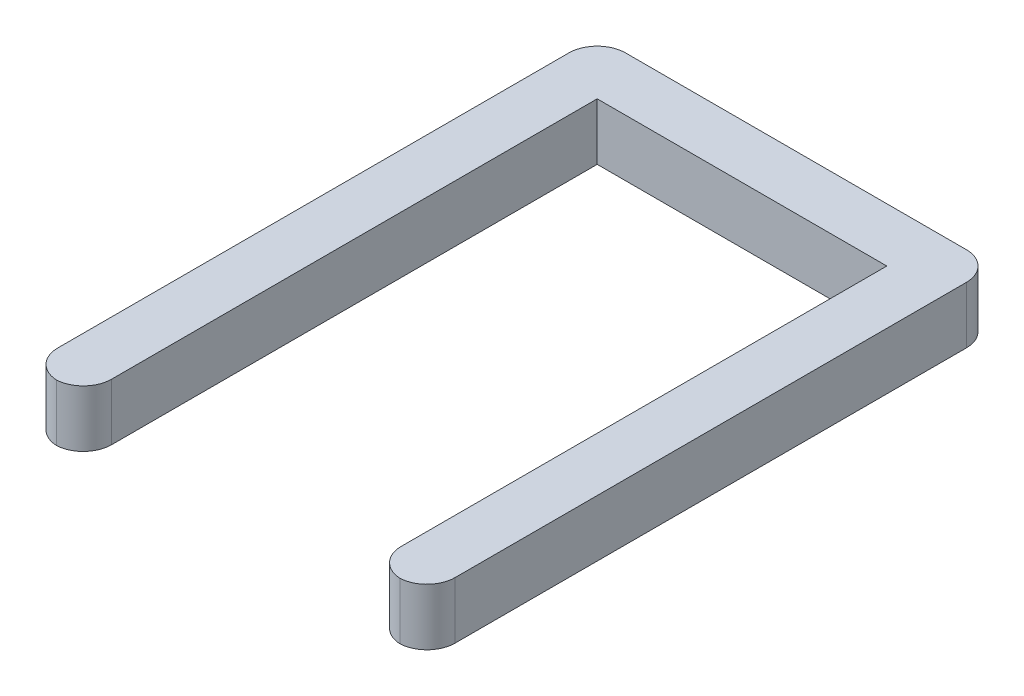
ISO-10303-21;
HEADER;
FILE_DESCRIPTION(('STEP AP214'),'2;1');
FILE_NAME('part.step','',(''),(''),'','','');
FILE_SCHEMA(('AUTOMOTIVE_DESIGN { 1 0 10303 214 1 1 1 1 }'));
ENDSEC;
DATA;
#1=APPLICATION_CONTEXT('core data for automotive mechanical design processes');
#2=APPLICATION_PROTOCOL_DEFINITION('international standard','automotive_design',2000,#1);
#3=PRODUCT_CONTEXT('',#1,'mechanical');
#4=PRODUCT('Part','Part','',(#3));
#5=PRODUCT_RELATED_PRODUCT_CATEGORY('part','',(#4));
#6=PRODUCT_DEFINITION_FORMATION('','',#4);
#7=PRODUCT_DEFINITION_CONTEXT('part definition',#1,'design');
#8=PRODUCT_DEFINITION('design','',#6,#7);
#9=PRODUCT_DEFINITION_SHAPE('','',#8);
#10=(LENGTH_UNIT() NAMED_UNIT(*) SI_UNIT(.MILLI.,.METRE.));
#11=(NAMED_UNIT(*) PLANE_ANGLE_UNIT() SI_UNIT($,.RADIAN.));
#12=(NAMED_UNIT(*) SI_UNIT($,.STERADIAN.) SOLID_ANGLE_UNIT());
#13=UNCERTAINTY_MEASURE_WITH_UNIT(LENGTH_MEASURE(1.E-05),#10,'distance_accuracy_value','');
#14=(GEOMETRIC_REPRESENTATION_CONTEXT(3) GLOBAL_UNCERTAINTY_ASSIGNED_CONTEXT((#13)) GLOBAL_UNIT_ASSIGNED_CONTEXT((#10,
#11,#12)) REPRESENTATION_CONTEXT('',''));
#15=CARTESIAN_POINT('',(0.,0.,0.));
#16=DIRECTION('',(0.,0.,1.));
#17=DIRECTION('',(1.,0.,0.));
#18=AXIS2_PLACEMENT_3D('',#15,#16,#17);
#19=CARTESIAN_POINT('',(0.,10.,0.));
#20=DIRECTION('',(1.,0.,0.));
#21=DIRECTION('',(0.,0.,-1.));
#22=AXIS2_PLACEMENT_3D('',#19,#20,#21);
#23=PLANE('',#22);
#24=DIRECTION('',(0.,0.,1.));
#25=VECTOR('',#24,1.);
#26=CARTESIAN_POINT('',(0.,10.,0.));
#27=LINE('',#26,#25);
#28=CARTESIAN_POINT('',(0.,10.,5.));
#29=VERTEX_POINT('',#28);
#30=CARTESIAN_POINT('',(0.,10.,95.));
#31=VERTEX_POINT('',#30);
#32=EDGE_CURVE('E158',#29,#31,#27,.T.);
#33=ORIENTED_EDGE('',*,*,#32,.F.);
#34=DIRECTION('',(0.,-1.,0.));
#35=VECTOR('',#34,1.);
#36=CARTESIAN_POINT('',(0.,10.,5.));
#37=LINE('',#36,#35);
#38=CARTESIAN_POINT('',(0.,0.,5.));
#39=VERTEX_POINT('',#38);
#40=EDGE_CURVE('E203',#29,#39,#37,.T.);
#41=ORIENTED_EDGE('',*,*,#40,.T.);
#42=DIRECTION('',(0.,0.,1.));
#43=VECTOR('',#42,1.);
#44=CARTESIAN_POINT('',(0.,0.,0.));
#45=LINE('',#44,#43);
#46=CARTESIAN_POINT('',(0.,0.,95.));
#47=VERTEX_POINT('',#46);
#48=EDGE_CURVE('E135',#39,#47,#45,.T.);
#49=ORIENTED_EDGE('',*,*,#48,.T.);
#50=DIRECTION('',(0.,-1.,0.));
#51=VECTOR('',#50,1.);
#52=CARTESIAN_POINT('',(0.,10.,95.));
#53=LINE('',#52,#51);
#54=EDGE_CURVE('E201',#47,#31,#53,.F.);
#55=ORIENTED_EDGE('',*,*,#54,.T.);
#56=EDGE_LOOP('',(#33,#41,#49,#55));
#57=FACE_BOUND('',#56,.T.);
#58=ADVANCED_FACE('F33',(#57),#23,.F.);
#59=CARTESIAN_POINT('',(70.,10.,0.));
#60=DIRECTION('',(-1.,0.,0.));
#61=DIRECTION('',(0.,0.,1.));
#62=AXIS2_PLACEMENT_3D('',#59,#60,#61);
#63=PLANE('',#62);
#64=DIRECTION('',(0.,0.,-1.));
#65=VECTOR('',#64,1.);
#66=CARTESIAN_POINT('',(70.,10.,0.));
#67=LINE('',#66,#65);
#68=CARTESIAN_POINT('',(70.,10.,95.));
#69=VERTEX_POINT('',#68);
#70=CARTESIAN_POINT('',(70.,10.,5.));
#71=VERTEX_POINT('',#70);
#72=EDGE_CURVE('E161',#69,#71,#67,.T.);
#73=ORIENTED_EDGE('',*,*,#72,.F.);
#74=DIRECTION('',(0.,-1.,0.));
#75=VECTOR('',#74,1.);
#76=CARTESIAN_POINT('',(70.,10.,95.));
#77=LINE('',#76,#75);
#78=CARTESIAN_POINT('',(70.,0.,95.));
#79=VERTEX_POINT('',#78);
#80=EDGE_CURVE('E11',#69,#79,#77,.T.);
#81=ORIENTED_EDGE('',*,*,#80,.T.);
#82=DIRECTION('',(0.,0.,-1.));
#83=VECTOR('',#82,1.);
#84=CARTESIAN_POINT('',(70.,0.,0.));
#85=LINE('',#84,#83);
#86=CARTESIAN_POINT('',(70.,0.,5.));
#87=VERTEX_POINT('',#86);
#88=EDGE_CURVE('E171',#79,#87,#85,.T.);
#89=ORIENTED_EDGE('',*,*,#88,.T.);
#90=DIRECTION('',(0.,-1.,0.));
#91=VECTOR('',#90,1.);
#92=CARTESIAN_POINT('',(70.,10.,5.));
#93=LINE('',#92,#91);
#94=EDGE_CURVE('E42',#87,#71,#93,.F.);
#95=ORIENTED_EDGE('',*,*,#94,.T.);
#96=EDGE_LOOP('',(#73,#81,#89,#95));
#97=FACE_BOUND('',#96,.T.);
#98=ADVANCED_FACE('F230',(#97),#63,.F.);
#99=CARTESIAN_POINT('',(0.,10.,0.));
#100=DIRECTION('',(0.,0.,1.));
#101=DIRECTION('',(1.,0.,0.));
#102=AXIS2_PLACEMENT_3D('',#99,#100,#101);
#103=PLANE('',#102);
#104=DIRECTION('',(-1.,0.,0.));
#105=VECTOR('',#104,1.);
#106=CARTESIAN_POINT('',(0.,0.,0.));
#107=LINE('',#106,#105);
#108=CARTESIAN_POINT('',(65.,0.,0.));
#109=VERTEX_POINT('',#108);
#110=CARTESIAN_POINT('',(5.,0.,0.));
#111=VERTEX_POINT('',#110);
#112=EDGE_CURVE('E162',#109,#111,#107,.T.);
#113=ORIENTED_EDGE('',*,*,#112,.T.);
#114=DIRECTION('',(0.,-1.,0.));
#115=VECTOR('',#114,1.);
#116=CARTESIAN_POINT('',(5.,10.,0.));
#117=LINE('',#116,#115);
#118=CARTESIAN_POINT('',(5.,10.,0.));
#119=VERTEX_POINT('',#118);
#120=EDGE_CURVE('E209',#111,#119,#117,.F.);
#121=ORIENTED_EDGE('',*,*,#120,.T.);
#122=DIRECTION('',(-1.,0.,0.));
#123=VECTOR('',#122,1.);
#124=CARTESIAN_POINT('',(0.,10.,0.));
#125=LINE('',#124,#123);
#126=CARTESIAN_POINT('',(65.,10.,0.));
#127=VERTEX_POINT('',#126);
#128=EDGE_CURVE('E165',#127,#119,#125,.T.);
#129=ORIENTED_EDGE('',*,*,#128,.F.);
#130=DIRECTION('',(0.,-1.,0.));
#131=VECTOR('',#130,1.);
#132=CARTESIAN_POINT('',(65.,10.,0.));
#133=LINE('',#132,#131);
#134=EDGE_CURVE('E206',#127,#109,#133,.T.);
#135=ORIENTED_EDGE('',*,*,#134,.T.);
#136=EDGE_LOOP('',(#113,#121,#129,#135));
#137=FACE_BOUND('',#136,.T.);
#138=ADVANCED_FACE('F237',(#137),#103,.F.);
#139=CARTESIAN_POINT('',(0.,10.,0.));
#140=DIRECTION('',(0.,1.,0.));
#141=DIRECTION('',(0.,0.,1.));
#142=AXIS2_PLACEMENT_3D('',#139,#140,#141);
#143=PLANE('',#142);
#144=ORIENTED_EDGE('',*,*,#128,.T.);
#145=CARTESIAN_POINT('',(5.,10.,5.));
#146=DIRECTION('',(0.,1.,0.));
#147=DIRECTION('',(0.,0.,1.));
#148=AXIS2_PLACEMENT_3D('',#145,#146,#147);
#149=CIRCLE('',#148,5.);
#150=EDGE_CURVE('E185',#119,#29,#149,.T.);
#151=ORIENTED_EDGE('',*,*,#150,.T.);
#152=ORIENTED_EDGE('',*,*,#32,.T.);
#153=CARTESIAN_POINT('',(5.00000000000001,10.,95.));
#154=DIRECTION('',(0.,1.,0.));
#155=DIRECTION('',(0.,0.,1.));
#156=AXIS2_PLACEMENT_3D('',#153,#154,#155);
#157=CIRCLE('',#156,5.);
#158=CARTESIAN_POINT('',(4.75000000000001,10.,99.9937460888596));
#159=VERTEX_POINT('',#158);
#160=EDGE_CURVE('E181',#31,#159,#157,.T.);
#161=ORIENTED_EDGE('',*,*,#160,.T.);
#162=CARTESIAN_POINT('',(4.50000000000001,10.,95.));
#163=DIRECTION('',(0.,1.,0.));
#164=DIRECTION('',(0.,0.,1.));
#165=AXIS2_PLACEMENT_3D('',#162,#163,#164);
#166=CIRCLE('',#165,5.);
#167=CARTESIAN_POINT('',(9.50000000000001,10.,95.));
#168=VERTEX_POINT('',#167);
#169=EDGE_CURVE('E183',#159,#168,#166,.T.);
#170=ORIENTED_EDGE('',*,*,#169,.T.);
#171=DIRECTION('',(0.,0.,1.));
#172=VECTOR('',#171,1.);
#173=CARTESIAN_POINT('',(9.5,10.,9.5));
#174=LINE('',#173,#172);
#175=CARTESIAN_POINT('',(9.5,10.,9.5));
#176=VERTEX_POINT('',#175);
#177=EDGE_CURVE('E152',#176,#168,#174,.T.);
#178=ORIENTED_EDGE('',*,*,#177,.F.);
#179=DIRECTION('',(-1.,0.,0.));
#180=VECTOR('',#179,1.);
#181=CARTESIAN_POINT('',(9.5,10.,9.5));
#182=LINE('',#181,#180);
#183=CARTESIAN_POINT('',(60.5,10.,9.5));
#184=VERTEX_POINT('',#183);
#185=EDGE_CURVE('E131',#184,#176,#182,.T.);
#186=ORIENTED_EDGE('',*,*,#185,.F.);
#187=DIRECTION('',(0.,0.,-1.));
#188=VECTOR('',#187,1.);
#189=CARTESIAN_POINT('',(60.5,10.,9.5));
#190=LINE('',#189,#188);
#191=CARTESIAN_POINT('',(60.5,10.,95.));
#192=VERTEX_POINT('',#191);
#193=EDGE_CURVE('E154',#192,#184,#190,.T.);
#194=ORIENTED_EDGE('',*,*,#193,.F.);
#195=CARTESIAN_POINT('',(65.5,10.,95.));
#196=DIRECTION('',(0.,1.,0.));
#197=DIRECTION('',(0.,0.,1.));
#198=AXIS2_PLACEMENT_3D('',#195,#196,#197);
#199=CIRCLE('',#198,5.);
#200=CARTESIAN_POINT('',(65.25,10.,99.9937460888596));
#201=VERTEX_POINT('',#200);
#202=EDGE_CURVE('E179',#192,#201,#199,.T.);
#203=ORIENTED_EDGE('',*,*,#202,.T.);
#204=CARTESIAN_POINT('',(65.,10.,95.));
#205=DIRECTION('',(0.,1.,0.));
#206=DIRECTION('',(0.,0.,1.));
#207=AXIS2_PLACEMENT_3D('',#204,#205,#206);
#208=CIRCLE('',#207,5.);
#209=EDGE_CURVE('E177',#201,#69,#208,.T.);
#210=ORIENTED_EDGE('',*,*,#209,.T.);
#211=ORIENTED_EDGE('',*,*,#72,.T.);
#212=CARTESIAN_POINT('',(65.,10.,5.));
#213=DIRECTION('',(0.,1.,0.));
#214=DIRECTION('',(0.,0.,1.));
#215=AXIS2_PLACEMENT_3D('',#212,#213,#214);
#216=CIRCLE('',#215,5.);
#217=EDGE_CURVE('E168',#71,#127,#216,.T.);
#218=ORIENTED_EDGE('',*,*,#217,.T.);
#219=EDGE_LOOP('',(#144,#151,#152,#161,#170,#178,#186,#194,#203,#210,#211,#218));
#220=FACE_BOUND('',#219,.T.);
#221=ADVANCED_FACE('F226',(#220),#143,.T.);
#222=CARTESIAN_POINT('',(0.,0.,0.));
#223=DIRECTION('',(0.,1.,0.));
#224=DIRECTION('',(0.,0.,1.));
#225=AXIS2_PLACEMENT_3D('',#222,#223,#224);
#226=PLANE('',#225);
#227=ORIENTED_EDGE('',*,*,#48,.F.);
#228=CARTESIAN_POINT('',(5.,0.,5.));
#229=DIRECTION('',(0.,1.,0.));
#230=DIRECTION('',(0.,0.,1.));
#231=AXIS2_PLACEMENT_3D('',#228,#229,#230);
#232=CIRCLE('',#231,5.);
#233=EDGE_CURVE('E196',#39,#111,#232,.F.);
#234=ORIENTED_EDGE('',*,*,#233,.T.);
#235=ORIENTED_EDGE('',*,*,#112,.F.);
#236=CARTESIAN_POINT('',(65.,0.,5.));
#237=DIRECTION('',(0.,1.,0.));
#238=DIRECTION('',(0.,0.,1.));
#239=AXIS2_PLACEMENT_3D('',#236,#237,#238);
#240=CIRCLE('',#239,5.);
#241=EDGE_CURVE('E188',#109,#87,#240,.F.);
#242=ORIENTED_EDGE('',*,*,#241,.T.);
#243=ORIENTED_EDGE('',*,*,#88,.F.);
#244=CARTESIAN_POINT('',(65.,0.,95.));
#245=DIRECTION('',(0.,1.,0.));
#246=DIRECTION('',(0.,0.,1.));
#247=AXIS2_PLACEMENT_3D('',#244,#245,#246);
#248=CIRCLE('',#247,5.);
#249=CARTESIAN_POINT('',(65.25,0.,99.9937460888596));
#250=VERTEX_POINT('',#249);
#251=EDGE_CURVE('E57',#79,#250,#248,.F.);
#252=ORIENTED_EDGE('',*,*,#251,.T.);
#253=CARTESIAN_POINT('',(65.5,0.,95.));
#254=DIRECTION('',(0.,1.,0.));
#255=DIRECTION('',(0.,0.,1.));
#256=AXIS2_PLACEMENT_3D('',#253,#254,#255);
#257=CIRCLE('',#256,5.);
#258=CARTESIAN_POINT('',(60.5,0.,95.));
#259=VERTEX_POINT('',#258);
#260=EDGE_CURVE('E191',#250,#259,#257,.F.);
#261=ORIENTED_EDGE('',*,*,#260,.T.);
#262=DIRECTION('',(0.,0.,-1.));
#263=VECTOR('',#262,1.);
#264=CARTESIAN_POINT('',(60.5,0.,9.5));
#265=LINE('',#264,#263);
#266=CARTESIAN_POINT('',(60.5,0.,9.5));
#267=VERTEX_POINT('',#266);
#268=EDGE_CURVE('E143',#259,#267,#265,.T.);
#269=ORIENTED_EDGE('',*,*,#268,.T.);
#270=DIRECTION('',(-1.,0.,0.));
#271=VECTOR('',#270,1.);
#272=CARTESIAN_POINT('',(9.5,0.,9.5));
#273=LINE('',#272,#271);
#274=CARTESIAN_POINT('',(9.5,0.,9.5));
#275=VERTEX_POINT('',#274);
#276=EDGE_CURVE('E128',#267,#275,#273,.T.);
#277=ORIENTED_EDGE('',*,*,#276,.T.);
#278=DIRECTION('',(0.,0.,1.));
#279=VECTOR('',#278,1.);
#280=CARTESIAN_POINT('',(9.5,0.,9.5));
#281=LINE('',#280,#279);
#282=CARTESIAN_POINT('',(9.50000000000001,0.,95.));
#283=VERTEX_POINT('',#282);
#284=EDGE_CURVE('E139',#275,#283,#281,.T.);
#285=ORIENTED_EDGE('',*,*,#284,.T.);
#286=CARTESIAN_POINT('',(4.50000000000001,0.,95.));
#287=DIRECTION('',(0.,1.,0.));
#288=DIRECTION('',(0.,0.,1.));
#289=AXIS2_PLACEMENT_3D('',#286,#287,#288);
#290=CIRCLE('',#289,5.);
#291=CARTESIAN_POINT('',(4.75000000000001,0.,99.9937460888596));
#292=VERTEX_POINT('',#291);
#293=EDGE_CURVE('E50',#283,#292,#290,.F.);
#294=ORIENTED_EDGE('',*,*,#293,.T.);
#295=CARTESIAN_POINT('',(5.00000000000001,0.,95.));
#296=DIRECTION('',(0.,1.,0.));
#297=DIRECTION('',(0.,0.,1.));
#298=AXIS2_PLACEMENT_3D('',#295,#296,#297);
#299=CIRCLE('',#298,5.);
#300=EDGE_CURVE('E193',#292,#47,#299,.F.);
#301=ORIENTED_EDGE('',*,*,#300,.T.);
#302=EDGE_LOOP('',(#227,#234,#235,#242,#243,#252,#261,#269,#277,#285,#294,#301));
#303=FACE_BOUND('',#302,.T.);
#304=ADVANCED_FACE('F146',(#303),#226,.F.);
#305=CARTESIAN_POINT('',(9.5,0.,9.5));
#306=DIRECTION('',(-1.,0.,0.));
#307=DIRECTION('',(0.,0.,1.));
#308=AXIS2_PLACEMENT_3D('',#305,#306,#307);
#309=PLANE('',#308);
#310=ORIENTED_EDGE('',*,*,#177,.T.);
#311=DIRECTION('',(0.,1.,0.));
#312=VECTOR('',#311,1.);
#313=CARTESIAN_POINT('',(9.50000000000001,0.,95.));
#314=LINE('',#313,#312);
#315=EDGE_CURVE('E142',#168,#283,#314,.F.);
#316=ORIENTED_EDGE('',*,*,#315,.T.);
#317=ORIENTED_EDGE('',*,*,#284,.F.);
#318=DIRECTION('',(0.,1.,0.));
#319=VECTOR('',#318,1.);
#320=CARTESIAN_POINT('',(9.5,0.,9.5));
#321=LINE('',#320,#319);
#322=EDGE_CURVE('E123',#275,#176,#321,.T.);
#323=ORIENTED_EDGE('',*,*,#322,.T.);
#324=EDGE_LOOP('',(#310,#316,#317,#323));
#325=FACE_BOUND('',#324,.T.);
#326=ADVANCED_FACE('F140',(#325),#309,.F.);
#327=CARTESIAN_POINT('',(9.5,0.,9.5));
#328=DIRECTION('',(0.,0.,-1.));
#329=DIRECTION('',(-1.,0.,0.));
#330=AXIS2_PLACEMENT_3D('',#327,#328,#329);
#331=PLANE('',#330);
#332=ORIENTED_EDGE('',*,*,#185,.T.);
#333=ORIENTED_EDGE('',*,*,#322,.F.);
#334=ORIENTED_EDGE('',*,*,#276,.F.);
#335=DIRECTION('',(0.,1.,0.));
#336=VECTOR('',#335,1.);
#337=CARTESIAN_POINT('',(60.5,0.,9.5));
#338=LINE('',#337,#336);
#339=EDGE_CURVE('E136',#267,#184,#338,.T.);
#340=ORIENTED_EDGE('',*,*,#339,.T.);
#341=EDGE_LOOP('',(#332,#333,#334,#340));
#342=FACE_BOUND('',#341,.T.);
#343=ADVANCED_FACE('F125',(#342),#331,.F.);
#344=CARTESIAN_POINT('',(60.5,0.,9.5));
#345=DIRECTION('',(1.,0.,0.));
#346=DIRECTION('',(0.,0.,-1.));
#347=AXIS2_PLACEMENT_3D('',#344,#345,#346);
#348=PLANE('',#347);
#349=ORIENTED_EDGE('',*,*,#268,.F.);
#350=DIRECTION('',(0.,1.,0.));
#351=VECTOR('',#350,1.);
#352=CARTESIAN_POINT('',(60.5,0.,95.));
#353=LINE('',#352,#351);
#354=EDGE_CURVE('E198',#259,#192,#353,.T.);
#355=ORIENTED_EDGE('',*,*,#354,.T.);
#356=ORIENTED_EDGE('',*,*,#193,.T.);
#357=ORIENTED_EDGE('',*,*,#339,.F.);
#358=EDGE_LOOP('',(#349,#355,#356,#357));
#359=FACE_BOUND('',#358,.T.);
#360=ADVANCED_FACE('F257',(#359),#348,.F.);
#361=CARTESIAN_POINT('',(5.00000000000001,10.,95.));
#362=DIRECTION('',(0.,-1.,0.));
#363=DIRECTION('',(0.,0.,-1.));
#364=AXIS2_PLACEMENT_3D('',#361,#362,#363);
#365=CYLINDRICAL_SURFACE('',#364,5.);
#366=ORIENTED_EDGE('',*,*,#54,.F.);
#367=ORIENTED_EDGE('',*,*,#300,.F.);
#368=DIRECTION('',(0.,-1.,0.));
#369=VECTOR('',#368,1.);
#370=CARTESIAN_POINT('',(4.75000000000001,5.,99.9937460888596));
#371=LINE('',#370,#369);
#372=EDGE_CURVE('E155',#159,#292,#371,.T.);
#373=ORIENTED_EDGE('',*,*,#372,.F.);
#374=ORIENTED_EDGE('',*,*,#160,.F.);
#375=EDGE_LOOP('',(#366,#367,#373,#374));
#376=FACE_BOUND('',#375,.T.);
#377=ADVANCED_FACE('F248',(#376),#365,.T.);
#378=CARTESIAN_POINT('',(4.50000000000001,10.,95.));
#379=DIRECTION('',(0.,1.,0.));
#380=DIRECTION('',(0.,0.,1.));
#381=AXIS2_PLACEMENT_3D('',#378,#379,#380);
#382=CYLINDRICAL_SURFACE('',#381,5.);
#383=ORIENTED_EDGE('',*,*,#293,.F.);
#384=ORIENTED_EDGE('',*,*,#315,.F.);
#385=ORIENTED_EDGE('',*,*,#169,.F.);
#386=ORIENTED_EDGE('',*,*,#372,.T.);
#387=EDGE_LOOP('',(#383,#384,#385,#386));
#388=FACE_BOUND('',#387,.T.);
#389=ADVANCED_FACE('F249',(#388),#382,.T.);
#390=CARTESIAN_POINT('',(65.,10.,95.));
#391=DIRECTION('',(0.,-1.,0.));
#392=DIRECTION('',(0.,0.,-1.));
#393=AXIS2_PLACEMENT_3D('',#390,#391,#392);
#394=CYLINDRICAL_SURFACE('',#393,5.);
#395=DIRECTION('',(0.,-1.,0.));
#396=VECTOR('',#395,1.);
#397=CARTESIAN_POINT('',(65.25,5.,99.9937460888596));
#398=LINE('',#397,#396);
#399=EDGE_CURVE('E37',#250,#201,#398,.F.);
#400=ORIENTED_EDGE('',*,*,#399,.F.);
#401=ORIENTED_EDGE('',*,*,#251,.F.);
#402=ORIENTED_EDGE('',*,*,#80,.F.);
#403=ORIENTED_EDGE('',*,*,#209,.F.);
#404=EDGE_LOOP('',(#400,#401,#402,#403));
#405=FACE_BOUND('',#404,.T.);
#406=ADVANCED_FACE('F222',(#405),#394,.T.);
#407=CARTESIAN_POINT('',(65.5,0.,95.));
#408=DIRECTION('',(0.,1.,0.));
#409=DIRECTION('',(0.,0.,1.));
#410=AXIS2_PLACEMENT_3D('',#407,#408,#409);
#411=CYLINDRICAL_SURFACE('',#410,5.);
#412=ORIENTED_EDGE('',*,*,#260,.F.);
#413=ORIENTED_EDGE('',*,*,#399,.T.);
#414=ORIENTED_EDGE('',*,*,#202,.F.);
#415=ORIENTED_EDGE('',*,*,#354,.F.);
#416=EDGE_LOOP('',(#412,#413,#414,#415));
#417=FACE_BOUND('',#416,.T.);
#418=ADVANCED_FACE('F218',(#417),#411,.T.);
#419=CARTESIAN_POINT('',(5.,10.,5.));
#420=DIRECTION('',(0.,-1.,0.));
#421=DIRECTION('',(0.,0.,-1.));
#422=AXIS2_PLACEMENT_3D('',#419,#420,#421);
#423=CYLINDRICAL_SURFACE('',#422,5.);
#424=ORIENTED_EDGE('',*,*,#150,.F.);
#425=ORIENTED_EDGE('',*,*,#120,.F.);
#426=ORIENTED_EDGE('',*,*,#233,.F.);
#427=ORIENTED_EDGE('',*,*,#40,.F.);
#428=EDGE_LOOP('',(#424,#425,#426,#427));
#429=FACE_BOUND('',#428,.T.);
#430=ADVANCED_FACE('F241',(#429),#423,.T.);
#431=CARTESIAN_POINT('',(65.,10.,5.));
#432=DIRECTION('',(0.,-1.,0.));
#433=DIRECTION('',(0.,0.,-1.));
#434=AXIS2_PLACEMENT_3D('',#431,#432,#433);
#435=CYLINDRICAL_SURFACE('',#434,5.);
#436=ORIENTED_EDGE('',*,*,#217,.F.);
#437=ORIENTED_EDGE('',*,*,#94,.F.);
#438=ORIENTED_EDGE('',*,*,#241,.F.);
#439=ORIENTED_EDGE('',*,*,#134,.F.);
#440=EDGE_LOOP('',(#436,#437,#438,#439));
#441=FACE_BOUND('',#440,.T.);
#442=ADVANCED_FACE('F35',(#441),#435,.T.);
#443=CLOSED_SHELL('',(#58,#98,#138,#221,#304,#326,#343,#360,#377,#389,#406,#418,#430,#442));
#444=MANIFOLD_SOLID_BREP('B2',#443);
#445=ADVANCED_BREP_SHAPE_REPRESENTATION('',(#18,#444),#14);
#446=SHAPE_DEFINITION_REPRESENTATION(#9,#445);
ENDSEC;
END-ISO-10303-21;
